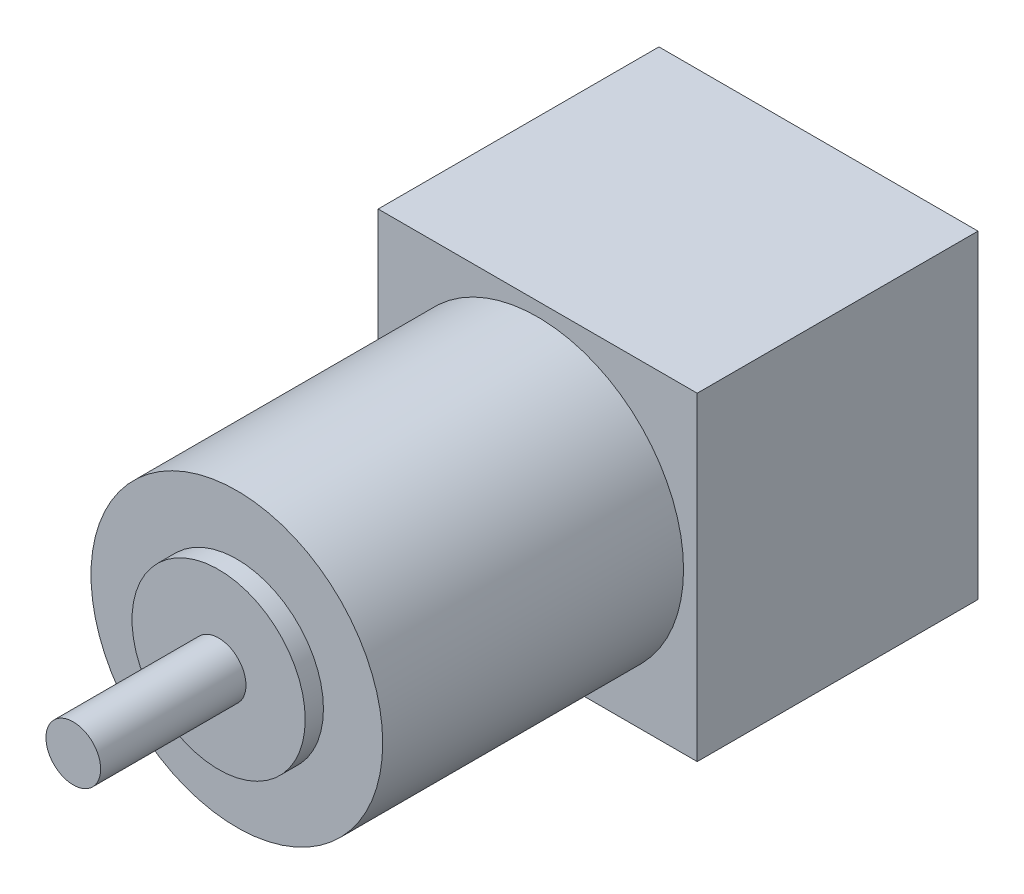
ISO-10303-21;
HEADER;
FILE_DESCRIPTION(('STEP AP214'),'2;1');
FILE_NAME('part.step','',(''),(''),'','','');
FILE_SCHEMA(('AUTOMOTIVE_DESIGN { 1 0 10303 214 1 1 1 1 }'));
ENDSEC;
DATA;
#1=APPLICATION_CONTEXT('core data for automotive mechanical design processes');
#2=APPLICATION_PROTOCOL_DEFINITION('international standard','automotive_design',2000,#1);
#3=PRODUCT_CONTEXT('',#1,'mechanical');
#4=PRODUCT('Part','Part','',(#3));
#5=PRODUCT_RELATED_PRODUCT_CATEGORY('part','',(#4));
#6=PRODUCT_DEFINITION_FORMATION('','',#4);
#7=PRODUCT_DEFINITION_CONTEXT('part definition',#1,'design');
#8=PRODUCT_DEFINITION('design','',#6,#7);
#9=PRODUCT_DEFINITION_SHAPE('','',#8);
#10=(LENGTH_UNIT() NAMED_UNIT(*) SI_UNIT(.MILLI.,.METRE.));
#11=(NAMED_UNIT(*) PLANE_ANGLE_UNIT() SI_UNIT($,.RADIAN.));
#12=(NAMED_UNIT(*) SI_UNIT($,.STERADIAN.) SOLID_ANGLE_UNIT());
#13=UNCERTAINTY_MEASURE_WITH_UNIT(LENGTH_MEASURE(1.E-05),#10,'distance_accuracy_value','');
#14=(GEOMETRIC_REPRESENTATION_CONTEXT(3) GLOBAL_UNCERTAINTY_ASSIGNED_CONTEXT((#13)) GLOBAL_UNIT_ASSIGNED_CONTEXT((#10,
#11,#12)) REPRESENTATION_CONTEXT('',''));
#15=CARTESIAN_POINT('',(0.,0.,0.));
#16=DIRECTION('',(0.,0.,1.));
#17=DIRECTION('',(1.,0.,0.));
#18=AXIS2_PLACEMENT_3D('',#15,#16,#17);
#19=CARTESIAN_POINT('',(17.5,-17.5,30.8));
#20=DIRECTION('',(-1.,0.,0.));
#21=DIRECTION('',(0.,0.,1.));
#22=AXIS2_PLACEMENT_3D('',#19,#20,#21);
#23=PLANE('',#22);
#24=DIRECTION('',(0.,1.,0.));
#25=VECTOR('',#24,1.);
#26=CARTESIAN_POINT('',(17.5,-17.5,0.));
#27=LINE('',#26,#25);
#28=CARTESIAN_POINT('',(17.5,-17.5,0.));
#29=VERTEX_POINT('',#28);
#30=CARTESIAN_POINT('',(17.5,17.5,0.));
#31=VERTEX_POINT('',#30);
#32=EDGE_CURVE('E104',#29,#31,#27,.T.);
#33=ORIENTED_EDGE('',*,*,#32,.T.);
#34=DIRECTION('',(0.,0.,-1.));
#35=VECTOR('',#34,1.);
#36=CARTESIAN_POINT('',(17.5,17.5,30.8));
#37=LINE('',#36,#35);
#38=CARTESIAN_POINT('',(17.5,17.5,30.8));
#39=VERTEX_POINT('',#38);
#40=EDGE_CURVE('E40',#39,#31,#37,.T.);
#41=ORIENTED_EDGE('',*,*,#40,.F.);
#42=DIRECTION('',(0.,1.,0.));
#43=VECTOR('',#42,1.);
#44=CARTESIAN_POINT('',(17.5,-17.5,30.8));
#45=LINE('',#44,#43);
#46=CARTESIAN_POINT('',(17.5,-17.5,30.8));
#47=VERTEX_POINT('',#46);
#48=EDGE_CURVE('E91',#47,#39,#45,.T.);
#49=ORIENTED_EDGE('',*,*,#48,.F.);
#50=DIRECTION('',(0.,0.,-1.));
#51=VECTOR('',#50,1.);
#52=CARTESIAN_POINT('',(17.5,-17.5,30.8));
#53=LINE('',#52,#51);
#54=EDGE_CURVE('E100',#47,#29,#53,.T.);
#55=ORIENTED_EDGE('',*,*,#54,.T.);
#56=EDGE_LOOP('',(#33,#41,#49,#55));
#57=FACE_BOUND('',#56,.T.);
#58=ADVANCED_FACE('F37',(#57),#23,.F.);
#59=CARTESIAN_POINT('',(-17.5,17.5,30.8));
#60=DIRECTION('',(0.,-1.,0.));
#61=DIRECTION('',(0.,0.,-1.));
#62=AXIS2_PLACEMENT_3D('',#59,#60,#61);
#63=PLANE('',#62);
#64=DIRECTION('',(-1.,0.,0.));
#65=VECTOR('',#64,1.);
#66=CARTESIAN_POINT('',(-17.5,17.5,0.));
#67=LINE('',#66,#65);
#68=CARTESIAN_POINT('',(-17.5,17.5,0.));
#69=VERTEX_POINT('',#68);
#70=EDGE_CURVE('E96',#31,#69,#67,.T.);
#71=ORIENTED_EDGE('',*,*,#70,.T.);
#72=DIRECTION('',(0.,0.,-1.));
#73=VECTOR('',#72,1.);
#74=CARTESIAN_POINT('',(-17.5,17.5,30.8));
#75=LINE('',#74,#73);
#76=CARTESIAN_POINT('',(-17.5,17.5,30.8));
#77=VERTEX_POINT('',#76);
#78=EDGE_CURVE('E94',#77,#69,#75,.T.);
#79=ORIENTED_EDGE('',*,*,#78,.F.);
#80=DIRECTION('',(-1.,0.,0.));
#81=VECTOR('',#80,1.);
#82=CARTESIAN_POINT('',(-17.5,17.5,30.8));
#83=LINE('',#82,#81);
#84=EDGE_CURVE('E86',#39,#77,#83,.T.);
#85=ORIENTED_EDGE('',*,*,#84,.F.);
#86=ORIENTED_EDGE('',*,*,#40,.T.);
#87=EDGE_LOOP('',(#71,#79,#85,#86));
#88=FACE_BOUND('',#87,.T.);
#89=ADVANCED_FACE('F95',(#88),#63,.F.);
#90=CARTESIAN_POINT('',(-17.5,-17.5,30.8));
#91=DIRECTION('',(1.,0.,0.));
#92=DIRECTION('',(0.,0.,-1.));
#93=AXIS2_PLACEMENT_3D('',#90,#91,#92);
#94=PLANE('',#93);
#95=DIRECTION('',(0.,-1.,0.));
#96=VECTOR('',#95,1.);
#97=CARTESIAN_POINT('',(-17.5,-17.5,0.));
#98=LINE('',#97,#96);
#99=CARTESIAN_POINT('',(-17.5,-17.5,0.));
#100=VERTEX_POINT('',#99);
#101=EDGE_CURVE('E72',#69,#100,#98,.T.);
#102=ORIENTED_EDGE('',*,*,#101,.T.);
#103=DIRECTION('',(0.,0.,-1.));
#104=VECTOR('',#103,1.);
#105=CARTESIAN_POINT('',(-17.5,-17.5,30.8));
#106=LINE('',#105,#104);
#107=CARTESIAN_POINT('',(-17.5,-17.5,30.8));
#108=VERTEX_POINT('',#107);
#109=EDGE_CURVE('E97',#108,#100,#106,.T.);
#110=ORIENTED_EDGE('',*,*,#109,.F.);
#111=DIRECTION('',(0.,-1.,0.));
#112=VECTOR('',#111,1.);
#113=CARTESIAN_POINT('',(-17.5,-17.5,30.8));
#114=LINE('',#113,#112);
#115=EDGE_CURVE('E89',#77,#108,#114,.T.);
#116=ORIENTED_EDGE('',*,*,#115,.F.);
#117=ORIENTED_EDGE('',*,*,#78,.T.);
#118=EDGE_LOOP('',(#102,#110,#116,#117));
#119=FACE_BOUND('',#118,.T.);
#120=ADVANCED_FACE('F98',(#119),#94,.F.);
#121=CARTESIAN_POINT('',(-17.5,-17.5,30.8));
#122=DIRECTION('',(0.,1.,0.));
#123=DIRECTION('',(0.,0.,1.));
#124=AXIS2_PLACEMENT_3D('',#121,#122,#123);
#125=PLANE('',#124);
#126=DIRECTION('',(1.,0.,0.));
#127=VECTOR('',#126,1.);
#128=CARTESIAN_POINT('',(-17.5,-17.5,0.));
#129=LINE('',#128,#127);
#130=EDGE_CURVE('E78',#100,#29,#129,.T.);
#131=ORIENTED_EDGE('',*,*,#130,.T.);
#132=ORIENTED_EDGE('',*,*,#54,.F.);
#133=DIRECTION('',(1.,0.,0.));
#134=VECTOR('',#133,1.);
#135=CARTESIAN_POINT('',(-17.5,-17.5,30.8));
#136=LINE('',#135,#134);
#137=EDGE_CURVE('E55',#108,#47,#136,.T.);
#138=ORIENTED_EDGE('',*,*,#137,.F.);
#139=ORIENTED_EDGE('',*,*,#109,.T.);
#140=EDGE_LOOP('',(#131,#132,#138,#139));
#141=FACE_BOUND('',#140,.T.);
#142=ADVANCED_FACE('F112',(#141),#125,.F.);
#143=CARTESIAN_POINT('',(0.,0.,30.8));
#144=DIRECTION('',(0.,0.,-1.));
#145=DIRECTION('',(-1.,0.,0.));
#146=AXIS2_PLACEMENT_3D('',#143,#144,#145);
#147=PLANE('',#146);
#148=CARTESIAN_POINT('',(0.,0.,30.8));
#149=DIRECTION('',(0.,0.,1.));
#150=DIRECTION('',(1.,0.,0.));
#151=AXIS2_PLACEMENT_3D('',#148,#149,#150);
#152=CIRCLE('',#151,16.);
#153=CARTESIAN_POINT('',(16.,0.,30.8));
#154=VERTEX_POINT('',#153);
#155=EDGE_CURVE('E118',#154,#154,#152,.T.);
#156=ORIENTED_EDGE('',*,*,#155,.F.);
#157=EDGE_LOOP('',(#156));
#158=FACE_BOUND('',#157,.T.);
#159=ORIENTED_EDGE('',*,*,#48,.T.);
#160=ORIENTED_EDGE('',*,*,#84,.T.);
#161=ORIENTED_EDGE('',*,*,#115,.T.);
#162=ORIENTED_EDGE('',*,*,#137,.T.);
#163=EDGE_LOOP('',(#159,#160,#161,#162));
#164=FACE_BOUND('',#163,.T.);
#165=ADVANCED_FACE('F87',(#158,#164),#147,.F.);
#166=CARTESIAN_POINT('',(0.,0.,0.));
#167=DIRECTION('',(0.,0.,-1.));
#168=DIRECTION('',(-1.,0.,0.));
#169=AXIS2_PLACEMENT_3D('',#166,#167,#168);
#170=PLANE('',#169);
#171=ORIENTED_EDGE('',*,*,#32,.F.);
#172=ORIENTED_EDGE('',*,*,#130,.F.);
#173=ORIENTED_EDGE('',*,*,#101,.F.);
#174=ORIENTED_EDGE('',*,*,#70,.F.);
#175=EDGE_LOOP('',(#171,#172,#173,#174));
#176=FACE_BOUND('',#175,.T.);
#177=ADVANCED_FACE('F115',(#176),#170,.T.);
#178=CARTESIAN_POINT('',(0.,0.,63.8));
#179=DIRECTION('',(0.,0.,-1.));
#180=DIRECTION('',(-1.,0.,0.));
#181=AXIS2_PLACEMENT_3D('',#178,#179,#180);
#182=CYLINDRICAL_SURFACE('',#181,16.);
#183=CARTESIAN_POINT('',(0.,0.,63.8));
#184=DIRECTION('',(0.,0.,1.));
#185=DIRECTION('',(1.,0.,0.));
#186=AXIS2_PLACEMENT_3D('',#183,#184,#185);
#187=CIRCLE('',#186,16.);
#188=CARTESIAN_POINT('',(16.,0.,63.8));
#189=VERTEX_POINT('',#188);
#190=EDGE_CURVE('E107',#189,#189,#187,.T.);
#191=ORIENTED_EDGE('',*,*,#190,.F.);
#192=EDGE_LOOP('',(#191));
#193=FACE_BOUND('',#192,.T.);
#194=ORIENTED_EDGE('',*,*,#155,.T.);
#195=EDGE_LOOP('',(#194));
#196=FACE_BOUND('',#195,.T.);
#197=ADVANCED_FACE('F155',(#193,#196),#182,.T.);
#198=CARTESIAN_POINT('',(0.,0.,63.8));
#199=DIRECTION('',(0.,0.,1.));
#200=DIRECTION('',(1.,0.,0.));
#201=AXIS2_PLACEMENT_3D('',#198,#199,#200);
#202=PLANE('',#201);
#203=CARTESIAN_POINT('',(0.,0.,63.8));
#204=DIRECTION('',(0.,0.,1.));
#205=DIRECTION('',(1.,0.,0.));
#206=AXIS2_PLACEMENT_3D('',#203,#204,#205);
#207=CIRCLE('',#206,9.5);
#208=CARTESIAN_POINT('',(9.5,0.,63.8));
#209=VERTEX_POINT('',#208);
#210=EDGE_CURVE('E46',#209,#209,#207,.T.);
#211=ORIENTED_EDGE('',*,*,#210,.F.);
#212=EDGE_LOOP('',(#211));
#213=FACE_BOUND('',#212,.T.);
#214=ORIENTED_EDGE('',*,*,#190,.T.);
#215=EDGE_LOOP('',(#214));
#216=FACE_BOUND('',#215,.T.);
#217=ADVANCED_FACE('F149',(#213,#216),#202,.T.);
#218=CARTESIAN_POINT('',(0.,0.,65.8));
#219=DIRECTION('',(0.,0.,-1.));
#220=DIRECTION('',(-1.,0.,0.));
#221=AXIS2_PLACEMENT_3D('',#218,#219,#220);
#222=CYLINDRICAL_SURFACE('',#221,9.5);
#223=CARTESIAN_POINT('',(0.,0.,65.8));
#224=DIRECTION('',(0.,0.,1.));
#225=DIRECTION('',(1.,0.,0.));
#226=AXIS2_PLACEMENT_3D('',#223,#224,#225);
#227=CIRCLE('',#226,9.5);
#228=CARTESIAN_POINT('',(9.5,0.,65.8));
#229=VERTEX_POINT('',#228);
#230=EDGE_CURVE('E123',#229,#229,#227,.T.);
#231=ORIENTED_EDGE('',*,*,#230,.F.);
#232=EDGE_LOOP('',(#231));
#233=FACE_BOUND('',#232,.T.);
#234=ORIENTED_EDGE('',*,*,#210,.T.);
#235=EDGE_LOOP('',(#234));
#236=FACE_BOUND('',#235,.T.);
#237=ADVANCED_FACE('F143',(#233,#236),#222,.T.);
#238=CARTESIAN_POINT('',(0.,0.,65.8));
#239=DIRECTION('',(0.,0.,1.));
#240=DIRECTION('',(1.,0.,0.));
#241=AXIS2_PLACEMENT_3D('',#238,#239,#240);
#242=PLANE('',#241);
#243=CARTESIAN_POINT('',(0.,0.,65.8));
#244=DIRECTION('',(0.,0.,1.));
#245=DIRECTION('',(1.,0.,0.));
#246=AXIS2_PLACEMENT_3D('',#243,#244,#245);
#247=CIRCLE('',#246,3.);
#248=CARTESIAN_POINT('',(3.,0.,65.8));
#249=VERTEX_POINT('',#248);
#250=EDGE_CURVE('E11',#249,#249,#247,.T.);
#251=ORIENTED_EDGE('',*,*,#250,.F.);
#252=EDGE_LOOP('',(#251));
#253=FACE_BOUND('',#252,.T.);
#254=ORIENTED_EDGE('',*,*,#230,.T.);
#255=EDGE_LOOP('',(#254));
#256=FACE_BOUND('',#255,.T.);
#257=ADVANCED_FACE('F137',(#253,#256),#242,.T.);
#258=CARTESIAN_POINT('',(0.,0.,81.74));
#259=DIRECTION('',(0.,0.,-1.));
#260=DIRECTION('',(-1.,0.,0.));
#261=AXIS2_PLACEMENT_3D('',#258,#259,#260);
#262=CYLINDRICAL_SURFACE('',#261,3.);
#263=CARTESIAN_POINT('',(0.,0.,81.74));
#264=DIRECTION('',(0.,0.,1.));
#265=DIRECTION('',(1.,0.,0.));
#266=AXIS2_PLACEMENT_3D('',#263,#264,#265);
#267=CIRCLE('',#266,3.);
#268=CARTESIAN_POINT('',(3.,0.,81.74));
#269=VERTEX_POINT('',#268);
#270=EDGE_CURVE('E127',#269,#269,#267,.T.);
#271=ORIENTED_EDGE('',*,*,#270,.F.);
#272=EDGE_LOOP('',(#271));
#273=FACE_BOUND('',#272,.T.);
#274=ORIENTED_EDGE('',*,*,#250,.T.);
#275=EDGE_LOOP('',(#274));
#276=FACE_BOUND('',#275,.T.);
#277=ADVANCED_FACE('F134',(#273,#276),#262,.T.);
#278=CARTESIAN_POINT('',(0.,0.,81.74));
#279=DIRECTION('',(0.,0.,1.));
#280=DIRECTION('',(1.,0.,0.));
#281=AXIS2_PLACEMENT_3D('',#278,#279,#280);
#282=PLANE('',#281);
#283=ORIENTED_EDGE('',*,*,#270,.T.);
#284=EDGE_LOOP('',(#283));
#285=FACE_BOUND('',#284,.T.);
#286=ADVANCED_FACE('F132',(#285),#282,.T.);
#287=CLOSED_SHELL('',(#58,#89,#120,#142,#165,#177,#197,#217,#237,#257,#277,#286));
#288=MANIFOLD_SOLID_BREP('B2',#287);
#289=ADVANCED_BREP_SHAPE_REPRESENTATION('',(#18,#288),#14);
#290=SHAPE_DEFINITION_REPRESENTATION(#9,#289);
ENDSEC;
END-ISO-10303-21;
